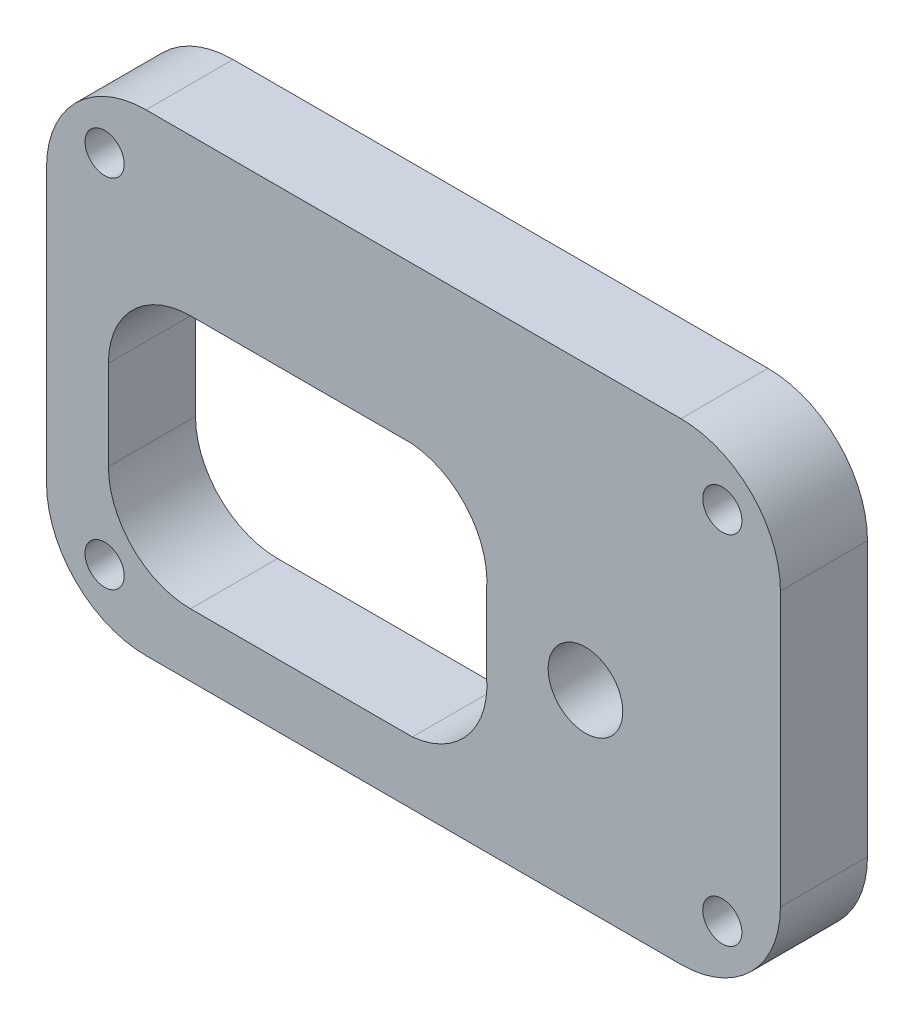
ISO-10303-21;
HEADER;
FILE_DESCRIPTION(('STEP AP214'),'2;1');
FILE_NAME('part.step','',(''),(''),'','','');
FILE_SCHEMA(('AUTOMOTIVE_DESIGN { 1 0 10303 214 1 1 1 1 }'));
ENDSEC;
DATA;
#1=APPLICATION_CONTEXT('core data for automotive mechanical design processes');
#2=APPLICATION_PROTOCOL_DEFINITION('international standard','automotive_design',2000,#1);
#3=PRODUCT_CONTEXT('',#1,'mechanical');
#4=PRODUCT('Part','Part','',(#3));
#5=PRODUCT_RELATED_PRODUCT_CATEGORY('part','',(#4));
#6=PRODUCT_DEFINITION_FORMATION('','',#4);
#7=PRODUCT_DEFINITION_CONTEXT('part definition',#1,'design');
#8=PRODUCT_DEFINITION('design','',#6,#7);
#9=PRODUCT_DEFINITION_SHAPE('','',#8);
#10=(LENGTH_UNIT() NAMED_UNIT(*) SI_UNIT(.MILLI.,.METRE.));
#11=(NAMED_UNIT(*) PLANE_ANGLE_UNIT() SI_UNIT($,.RADIAN.));
#12=(NAMED_UNIT(*) SI_UNIT($,.STERADIAN.) SOLID_ANGLE_UNIT());
#13=UNCERTAINTY_MEASURE_WITH_UNIT(LENGTH_MEASURE(1.E-05),#10,'distance_accuracy_value','');
#14=(GEOMETRIC_REPRESENTATION_CONTEXT(3) GLOBAL_UNCERTAINTY_ASSIGNED_CONTEXT((#13)) GLOBAL_UNIT_ASSIGNED_CONTEXT((#10,
#11,#12)) REPRESENTATION_CONTEXT('',''));
#15=CARTESIAN_POINT('',(0.,0.,0.));
#16=DIRECTION('',(0.,0.,1.));
#17=DIRECTION('',(1.,0.,0.));
#18=AXIS2_PLACEMENT_3D('',#15,#16,#17);
#19=CARTESIAN_POINT('',(0.,0.,4.445));
#20=DIRECTION('',(0.,0.,-1.));
#21=DIRECTION('',(-1.,0.,0.));
#22=AXIS2_PLACEMENT_3D('',#19,#20,#21);
#23=PLANE('',#22);
#24=CARTESIAN_POINT('',(2.96575072425223,2.96575072425223,4.445));
#25=DIRECTION('',(0.,0.,-1.));
#26=DIRECTION('',(-1.,0.,0.));
#27=AXIS2_PLACEMENT_3D('',#24,#25,#26);
#28=CIRCLE('',#27,0.999999999999998);
#29=CARTESIAN_POINT('',(1.96575072425223,2.96575072425223,4.445));
#30=VERTEX_POINT('',#29);
#31=EDGE_CURVE('E458',#30,#30,#28,.T.);
#32=ORIENTED_EDGE('',*,*,#31,.T.);
#33=EDGE_LOOP('',(#32));
#34=FACE_BOUND('',#33,.T.);
#35=CARTESIAN_POINT('',(34.4992492757478,21.1642492757478,4.445));
#36=DIRECTION('',(0.,0.,-1.));
#37=DIRECTION('',(-1.,0.,0.));
#38=AXIS2_PLACEMENT_3D('',#35,#36,#37);
#39=CIRCLE('',#38,0.999999999999998);
#40=CARTESIAN_POINT('',(33.4992492757478,21.1642492757478,4.445));
#41=VERTEX_POINT('',#40);
#42=EDGE_CURVE('E183',#41,#41,#39,.T.);
#43=ORIENTED_EDGE('',*,*,#42,.T.);
#44=EDGE_LOOP('',(#43));
#45=FACE_BOUND('',#44,.T.);
#46=DIRECTION('',(0.,1.,0.));
#47=VECTOR('',#46,1.);
#48=CARTESIAN_POINT('',(37.465,0.,4.445));
#49=LINE('',#48,#47);
#50=CARTESIAN_POINT('',(37.465,5.08,4.445));
#51=VERTEX_POINT('',#50);
#52=CARTESIAN_POINT('',(37.465,19.05,4.445));
#53=VERTEX_POINT('',#52);
#54=EDGE_CURVE('E256',#51,#53,#49,.T.);
#55=ORIENTED_EDGE('',*,*,#54,.T.);
#56=CARTESIAN_POINT('',(32.385,19.05,4.445));
#57=DIRECTION('',(0.,0.,-1.));
#58=DIRECTION('',(-1.,0.,0.));
#59=AXIS2_PLACEMENT_3D('',#56,#57,#58);
#60=CIRCLE('',#59,5.08);
#61=CARTESIAN_POINT('',(32.385,24.13,4.445));
#62=VERTEX_POINT('',#61);
#63=EDGE_CURVE('E312',#53,#62,#60,.F.);
#64=ORIENTED_EDGE('',*,*,#63,.T.);
#65=DIRECTION('',(-1.,0.,0.));
#66=VECTOR('',#65,1.);
#67=CARTESIAN_POINT('',(0.,24.13,4.445));
#68=LINE('',#67,#66);
#69=CARTESIAN_POINT('',(5.08,24.13,4.445));
#70=VERTEX_POINT('',#69);
#71=EDGE_CURVE('E260',#62,#70,#68,.T.);
#72=ORIENTED_EDGE('',*,*,#71,.T.);
#73=CARTESIAN_POINT('',(5.08,19.05,4.445));
#74=DIRECTION('',(0.,0.,-1.));
#75=DIRECTION('',(-1.,0.,0.));
#76=AXIS2_PLACEMENT_3D('',#73,#74,#75);
#77=CIRCLE('',#76,5.08);
#78=CARTESIAN_POINT('',(0.,19.05,4.445));
#79=VERTEX_POINT('',#78);
#80=EDGE_CURVE('E303',#70,#79,#77,.F.);
#81=ORIENTED_EDGE('',*,*,#80,.T.);
#82=DIRECTION('',(0.,-1.,0.));
#83=VECTOR('',#82,1.);
#84=CARTESIAN_POINT('',(0.,0.,4.445));
#85=LINE('',#84,#83);
#86=CARTESIAN_POINT('',(0.,5.08,4.445));
#87=VERTEX_POINT('',#86);
#88=EDGE_CURVE('E248',#79,#87,#85,.T.);
#89=ORIENTED_EDGE('',*,*,#88,.T.);
#90=CARTESIAN_POINT('',(5.08,5.08,4.445));
#91=DIRECTION('',(0.,0.,-1.));
#92=DIRECTION('',(-1.,0.,0.));
#93=AXIS2_PLACEMENT_3D('',#90,#91,#92);
#94=CIRCLE('',#93,5.08);
#95=CARTESIAN_POINT('',(5.08,0.,4.445));
#96=VERTEX_POINT('',#95);
#97=EDGE_CURVE('E306',#87,#96,#94,.F.);
#98=ORIENTED_EDGE('',*,*,#97,.T.);
#99=DIRECTION('',(1.,0.,0.));
#100=VECTOR('',#99,1.);
#101=CARTESIAN_POINT('',(0.,0.,4.445));
#102=LINE('',#101,#100);
#103=CARTESIAN_POINT('',(32.385,0.,4.445));
#104=VERTEX_POINT('',#103);
#105=EDGE_CURVE('E252',#96,#104,#102,.T.);
#106=ORIENTED_EDGE('',*,*,#105,.T.);
#107=CARTESIAN_POINT('',(32.385,5.08,4.445));
#108=DIRECTION('',(0.,0.,-1.));
#109=DIRECTION('',(-1.,0.,0.));
#110=AXIS2_PLACEMENT_3D('',#107,#108,#109);
#111=CIRCLE('',#110,5.08);
#112=EDGE_CURVE('E309',#104,#51,#111,.F.);
#113=ORIENTED_EDGE('',*,*,#112,.T.);
#114=EDGE_LOOP('',(#55,#64,#72,#81,#89,#98,#106,#113));
#115=FACE_BOUND('',#114,.T.);
#116=CARTESIAN_POINT('',(7.35086965438628,11.9679737585275,4.445));
#117=DIRECTION('',(0.,0.,-1.));
#118=DIRECTION('',(-1.,0.,0.));
#119=AXIS2_PLACEMENT_3D('',#116,#117,#118);
#120=CIRCLE('',#119,4.19100000000001);
#121=CARTESIAN_POINT('',(7.35086965438628,16.1589737585275,4.445));
#122=VERTEX_POINT('',#121);
#123=CARTESIAN_POINT('',(3.15986965438627,11.9679737585275,4.445));
#124=VERTEX_POINT('',#123);
#125=EDGE_CURVE('E205',#122,#124,#120,.F.);
#126=ORIENTED_EDGE('',*,*,#125,.F.);
#127=DIRECTION('',(-1.,0.,0.));
#128=VECTOR('',#127,1.);
#129=CARTESIAN_POINT('',(0.,16.1589737585275,4.445));
#130=LINE('',#129,#128);
#131=CARTESIAN_POINT('',(18.6779953133422,16.1589737585275,4.445));
#132=VERTEX_POINT('',#131);
#133=EDGE_CURVE('E201',#132,#122,#130,.T.);
#134=ORIENTED_EDGE('',*,*,#133,.F.);
#135=CARTESIAN_POINT('',(18.2728696543863,11.9679737585275,4.445));
#136=DIRECTION('',(0.,0.,-1.));
#137=DIRECTION('',(-1.,0.,0.));
#138=AXIS2_PLACEMENT_3D('',#135,#136,#137);
#139=CIRCLE('',#138,4.21053533408098);
#140=CARTESIAN_POINT('',(22.4638696543863,11.5628480995716,4.445));
#141=VERTEX_POINT('',#140);
#142=EDGE_CURVE('E197',#141,#132,#139,.F.);
#143=ORIENTED_EDGE('',*,*,#142,.F.);
#144=DIRECTION('',(0.,1.,0.));
#145=VECTOR('',#144,1.);
#146=CARTESIAN_POINT('',(22.4638696543863,0.,4.445));
#147=LINE('',#146,#145);
#148=CARTESIAN_POINT('',(22.4638696543863,7.80109941748326,4.445));
#149=VERTEX_POINT('',#148);
#150=EDGE_CURVE('E193',#149,#141,#147,.T.);
#151=ORIENTED_EDGE('',*,*,#150,.F.);
#152=CARTESIAN_POINT('',(18.2728696543863,7.39597375852747,4.445));
#153=DIRECTION('',(0.,0.,-1.));
#154=DIRECTION('',(-1.,0.,0.));
#155=AXIS2_PLACEMENT_3D('',#152,#153,#154);
#156=CIRCLE('',#155,4.21053533408095);
#157=CARTESIAN_POINT('',(18.6779953133419,3.20497375852747,4.445));
#158=VERTEX_POINT('',#157);
#159=EDGE_CURVE('E178',#158,#149,#156,.F.);
#160=ORIENTED_EDGE('',*,*,#159,.F.);
#161=DIRECTION('',(1.,0.,0.));
#162=VECTOR('',#161,1.);
#163=CARTESIAN_POINT('',(0.,3.20497375852747,4.445));
#164=LINE('',#163,#162);
#165=CARTESIAN_POINT('',(7.35086965438665,3.20497375852747,4.445));
#166=VERTEX_POINT('',#165);
#167=EDGE_CURVE('E160',#166,#158,#164,.T.);
#168=ORIENTED_EDGE('',*,*,#167,.F.);
#169=CARTESIAN_POINT('',(7.35086965438626,7.39597375852747,4.445));
#170=DIRECTION('',(0.,0.,-1.));
#171=DIRECTION('',(-1.,0.,0.));
#172=AXIS2_PLACEMENT_3D('',#169,#170,#171);
#173=CIRCLE('',#172,4.191);
#174=CARTESIAN_POINT('',(3.15986965438626,7.39597375852747,4.445));
#175=VERTEX_POINT('',#174);
#176=EDGE_CURVE('E175',#175,#166,#173,.F.);
#177=ORIENTED_EDGE('',*,*,#176,.F.);
#178=DIRECTION('',(0.,-1.,0.));
#179=VECTOR('',#178,1.);
#180=CARTESIAN_POINT('',(3.15986965438626,0.,4.445));
#181=LINE('',#180,#179);
#182=EDGE_CURVE('E209',#124,#175,#181,.T.);
#183=ORIENTED_EDGE('',*,*,#182,.F.);
#184=EDGE_LOOP('',(#126,#134,#143,#151,#160,#168,#177,#183));
#185=FACE_BOUND('',#184,.T.);
#186=CARTESIAN_POINT('',(27.511650568665,9.68988988046832,4.445));
#187=DIRECTION('',(0.,0.,-1.));
#188=DIRECTION('',(-1.,0.,0.));
#189=AXIS2_PLACEMENT_3D('',#186,#187,#188);
#190=CIRCLE('',#189,1.905);
#191=CARTESIAN_POINT('',(25.606650568665,9.68988988046832,4.445));
#192=VERTEX_POINT('',#191);
#193=EDGE_CURVE('E212',#192,#192,#190,.F.);
#194=ORIENTED_EDGE('',*,*,#193,.F.);
#195=EDGE_LOOP('',(#194));
#196=FACE_BOUND('',#195,.T.);
#197=CARTESIAN_POINT('',(2.96575072425223,21.1642492757478,4.445));
#198=DIRECTION('',(0.,0.,-1.));
#199=DIRECTION('',(-1.,0.,0.));
#200=AXIS2_PLACEMENT_3D('',#197,#198,#199);
#201=CIRCLE('',#200,0.999999999999998);
#202=CARTESIAN_POINT('',(1.96575072425223,21.1642492757478,4.445));
#203=VERTEX_POINT('',#202);
#204=EDGE_CURVE('E465',#203,#203,#201,.F.);
#205=ORIENTED_EDGE('',*,*,#204,.F.);
#206=EDGE_LOOP('',(#205));
#207=FACE_BOUND('',#206,.T.);
#208=CARTESIAN_POINT('',(34.4992492757478,2.96575072425222,4.445));
#209=DIRECTION('',(0.,0.,-1.));
#210=DIRECTION('',(-1.,0.,0.));
#211=AXIS2_PLACEMENT_3D('',#208,#209,#210);
#212=CIRCLE('',#211,0.999999999999998);
#213=CARTESIAN_POINT('',(33.4992492757478,2.96575072425222,4.445));
#214=VERTEX_POINT('',#213);
#215=EDGE_CURVE('E450',#214,#214,#212,.F.);
#216=ORIENTED_EDGE('',*,*,#215,.F.);
#217=EDGE_LOOP('',(#216));
#218=FACE_BOUND('',#217,.T.);
#219=ADVANCED_FACE('F41',(#34,#45,#115,#185,#196,#207,#218),#23,.F.);
#220=CARTESIAN_POINT('',(0.,0.,0.));
#221=DIRECTION('',(0.,0.,-1.));
#222=DIRECTION('',(-1.,0.,0.));
#223=AXIS2_PLACEMENT_3D('',#220,#221,#222);
#224=PLANE('',#223);
#225=CARTESIAN_POINT('',(2.96575072425223,21.1642492757478,0.));
#226=DIRECTION('',(0.,0.,-1.));
#227=DIRECTION('',(-1.,0.,0.));
#228=AXIS2_PLACEMENT_3D('',#225,#226,#227);
#229=CIRCLE('',#228,0.999999999999998);
#230=CARTESIAN_POINT('',(1.96575072425223,21.1642492757478,0.));
#231=VERTEX_POINT('',#230);
#232=EDGE_CURVE('E461',#231,#231,#229,.F.);
#233=ORIENTED_EDGE('',*,*,#232,.T.);
#234=EDGE_LOOP('',(#233));
#235=FACE_BOUND('',#234,.T.);
#236=CARTESIAN_POINT('',(34.4992492757478,21.1642492757478,0.));
#237=DIRECTION('',(0.,0.,-1.));
#238=DIRECTION('',(-1.,0.,0.));
#239=AXIS2_PLACEMENT_3D('',#236,#237,#238);
#240=CIRCLE('',#239,0.999999999999998);
#241=CARTESIAN_POINT('',(33.4992492757478,21.1642492757478,0.));
#242=VERTEX_POINT('',#241);
#243=EDGE_CURVE('E187',#242,#242,#240,.T.);
#244=ORIENTED_EDGE('',*,*,#243,.F.);
#245=EDGE_LOOP('',(#244));
#246=FACE_BOUND('',#245,.T.);
#247=CARTESIAN_POINT('',(27.511650568665,9.68988988046832,0.));
#248=DIRECTION('',(0.,0.,-1.));
#249=DIRECTION('',(-1.,0.,0.));
#250=AXIS2_PLACEMENT_3D('',#247,#248,#249);
#251=CIRCLE('',#250,1.27);
#252=CARTESIAN_POINT('',(26.241650568665,9.68988988046832,0.));
#253=VERTEX_POINT('',#252);
#254=EDGE_CURVE('E224',#253,#253,#251,.T.);
#255=ORIENTED_EDGE('',*,*,#254,.F.);
#256=EDGE_LOOP('',(#255));
#257=FACE_BOUND('',#256,.T.);
#258=CARTESIAN_POINT('',(7.35086965438628,11.9679737585275,0.));
#259=DIRECTION('',(0.,0.,-1.));
#260=DIRECTION('',(-1.,0.,0.));
#261=AXIS2_PLACEMENT_3D('',#258,#259,#260);
#262=CIRCLE('',#261,4.19100000000001);
#263=CARTESIAN_POINT('',(3.15986965438626,11.9679737585274,0.));
#264=VERTEX_POINT('',#263);
#265=CARTESIAN_POINT('',(7.35086965438628,16.1589737585275,0.));
#266=VERTEX_POINT('',#265);
#267=EDGE_CURVE('E11',#264,#266,#262,.T.);
#268=ORIENTED_EDGE('',*,*,#267,.F.);
#269=DIRECTION('',(0.,1.,0.));
#270=VECTOR('',#269,1.);
#271=CARTESIAN_POINT('',(3.15986965438626,0.,0.));
#272=LINE('',#271,#270);
#273=CARTESIAN_POINT('',(3.15986965438626,7.39597375852747,0.));
#274=VERTEX_POINT('',#273);
#275=EDGE_CURVE('E328',#274,#264,#272,.T.);
#276=ORIENTED_EDGE('',*,*,#275,.F.);
#277=CARTESIAN_POINT('',(7.35086965438626,7.39597375852747,0.));
#278=DIRECTION('',(0.,0.,-1.));
#279=DIRECTION('',(-1.,0.,0.));
#280=AXIS2_PLACEMENT_3D('',#277,#278,#279);
#281=CIRCLE('',#280,4.191);
#282=CARTESIAN_POINT('',(7.35086965438665,3.20497375852747,0.));
#283=VERTEX_POINT('',#282);
#284=EDGE_CURVE('E331',#283,#274,#281,.T.);
#285=ORIENTED_EDGE('',*,*,#284,.F.);
#286=DIRECTION('',(-1.,0.,0.));
#287=VECTOR('',#286,1.);
#288=CARTESIAN_POINT('',(0.,3.20497375852747,0.));
#289=LINE('',#288,#287);
#290=CARTESIAN_POINT('',(18.6779953133419,3.20497375852747,0.));
#291=VERTEX_POINT('',#290);
#292=EDGE_CURVE('E162',#291,#283,#289,.T.);
#293=ORIENTED_EDGE('',*,*,#292,.F.);
#294=CARTESIAN_POINT('',(18.2728696543863,7.39597375852747,0.));
#295=DIRECTION('',(0.,0.,-1.));
#296=DIRECTION('',(-1.,0.,0.));
#297=AXIS2_PLACEMENT_3D('',#294,#295,#296);
#298=CIRCLE('',#297,4.21053533408095);
#299=CARTESIAN_POINT('',(22.4638696543863,7.80109941748326,0.));
#300=VERTEX_POINT('',#299);
#301=EDGE_CURVE('E336',#300,#291,#298,.T.);
#302=ORIENTED_EDGE('',*,*,#301,.F.);
#303=DIRECTION('',(0.,1.,0.));
#304=VECTOR('',#303,1.);
#305=CARTESIAN_POINT('',(22.4638696543863,0.,0.));
#306=LINE('',#305,#304);
#307=CARTESIAN_POINT('',(22.4638696543863,11.5628480995716,0.));
#308=VERTEX_POINT('',#307);
#309=EDGE_CURVE('E339',#300,#308,#306,.T.);
#310=ORIENTED_EDGE('',*,*,#309,.T.);
#311=CARTESIAN_POINT('',(18.2728696543863,11.9679737585275,0.));
#312=DIRECTION('',(0.,0.,-1.));
#313=DIRECTION('',(-1.,0.,0.));
#314=AXIS2_PLACEMENT_3D('',#311,#312,#313);
#315=CIRCLE('',#314,4.21053533408098);
#316=CARTESIAN_POINT('',(18.6779953133422,16.1589737585275,0.));
#317=VERTEX_POINT('',#316);
#318=EDGE_CURVE('E343',#308,#317,#315,.F.);
#319=ORIENTED_EDGE('',*,*,#318,.T.);
#320=DIRECTION('',(-1.,0.,0.));
#321=VECTOR('',#320,1.);
#322=CARTESIAN_POINT('',(0.,16.1589737585275,0.));
#323=LINE('',#322,#321);
#324=EDGE_CURVE('E50',#317,#266,#323,.T.);
#325=ORIENTED_EDGE('',*,*,#324,.T.);
#326=EDGE_LOOP('',(#268,#276,#285,#293,#302,#310,#319,#325));
#327=FACE_BOUND('',#326,.T.);
#328=DIRECTION('',(-1.,0.,0.));
#329=VECTOR('',#328,1.);
#330=CARTESIAN_POINT('',(0.,24.13,0.));
#331=LINE('',#330,#329);
#332=CARTESIAN_POINT('',(32.385,24.13,0.));
#333=VERTEX_POINT('',#332);
#334=CARTESIAN_POINT('',(5.08,24.13,0.));
#335=VERTEX_POINT('',#334);
#336=EDGE_CURVE('E253',#333,#335,#331,.T.);
#337=ORIENTED_EDGE('',*,*,#336,.F.);
#338=CARTESIAN_POINT('',(32.385,19.05,0.));
#339=DIRECTION('',(0.,0.,-1.));
#340=DIRECTION('',(-1.,0.,0.));
#341=AXIS2_PLACEMENT_3D('',#338,#339,#340);
#342=CIRCLE('',#341,5.08);
#343=CARTESIAN_POINT('',(37.465,19.05,0.));
#344=VERTEX_POINT('',#343);
#345=EDGE_CURVE('E293',#333,#344,#342,.T.);
#346=ORIENTED_EDGE('',*,*,#345,.T.);
#347=DIRECTION('',(0.,1.,0.));
#348=VECTOR('',#347,1.);
#349=CARTESIAN_POINT('',(37.465,0.,0.));
#350=LINE('',#349,#348);
#351=CARTESIAN_POINT('',(37.465,5.08,0.));
#352=VERTEX_POINT('',#351);
#353=EDGE_CURVE('E271',#352,#344,#350,.T.);
#354=ORIENTED_EDGE('',*,*,#353,.F.);
#355=CARTESIAN_POINT('',(32.385,5.08,0.));
#356=DIRECTION('',(0.,0.,-1.));
#357=DIRECTION('',(-1.,0.,0.));
#358=AXIS2_PLACEMENT_3D('',#355,#356,#357);
#359=CIRCLE('',#358,5.08);
#360=CARTESIAN_POINT('',(32.385,0.,0.));
#361=VERTEX_POINT('',#360);
#362=EDGE_CURVE('E290',#352,#361,#359,.T.);
#363=ORIENTED_EDGE('',*,*,#362,.T.);
#364=DIRECTION('',(1.,0.,0.));
#365=VECTOR('',#364,1.);
#366=CARTESIAN_POINT('',(0.,0.,0.));
#367=LINE('',#366,#365);
#368=CARTESIAN_POINT('',(5.08,0.,0.));
#369=VERTEX_POINT('',#368);
#370=EDGE_CURVE('E268',#369,#361,#367,.T.);
#371=ORIENTED_EDGE('',*,*,#370,.F.);
#372=CARTESIAN_POINT('',(5.08,5.08,0.));
#373=DIRECTION('',(0.,0.,-1.));
#374=DIRECTION('',(-1.,0.,0.));
#375=AXIS2_PLACEMENT_3D('',#372,#373,#374);
#376=CIRCLE('',#375,5.08);
#377=CARTESIAN_POINT('',(0.,5.08,0.));
#378=VERTEX_POINT('',#377);
#379=EDGE_CURVE('E287',#369,#378,#376,.T.);
#380=ORIENTED_EDGE('',*,*,#379,.T.);
#381=DIRECTION('',(0.,-1.,0.));
#382=VECTOR('',#381,1.);
#383=CARTESIAN_POINT('',(0.,0.,0.));
#384=LINE('',#383,#382);
#385=CARTESIAN_POINT('',(0.,19.05,0.));
#386=VERTEX_POINT('',#385);
#387=EDGE_CURVE('E232',#386,#378,#384,.T.);
#388=ORIENTED_EDGE('',*,*,#387,.F.);
#389=CARTESIAN_POINT('',(5.08,19.05,0.));
#390=DIRECTION('',(0.,0.,-1.));
#391=DIRECTION('',(-1.,0.,0.));
#392=AXIS2_PLACEMENT_3D('',#389,#390,#391);
#393=CIRCLE('',#392,5.08);
#394=EDGE_CURVE('E284',#386,#335,#393,.T.);
#395=ORIENTED_EDGE('',*,*,#394,.T.);
#396=EDGE_LOOP('',(#337,#346,#354,#363,#371,#380,#388,#395));
#397=FACE_BOUND('',#396,.T.);
#398=CARTESIAN_POINT('',(2.96575072425223,2.96575072425223,0.));
#399=DIRECTION('',(0.,0.,-1.));
#400=DIRECTION('',(-1.,0.,0.));
#401=AXIS2_PLACEMENT_3D('',#398,#399,#400);
#402=CIRCLE('',#401,0.999999999999998);
#403=CARTESIAN_POINT('',(1.96575072425223,2.96575072425223,0.));
#404=VERTEX_POINT('',#403);
#405=EDGE_CURVE('E444',#404,#404,#402,.T.);
#406=ORIENTED_EDGE('',*,*,#405,.F.);
#407=EDGE_LOOP('',(#406));
#408=FACE_BOUND('',#407,.T.);
#409=CARTESIAN_POINT('',(34.4992492757478,2.96575072425222,0.));
#410=DIRECTION('',(0.,0.,-1.));
#411=DIRECTION('',(-1.,0.,0.));
#412=AXIS2_PLACEMENT_3D('',#409,#410,#411);
#413=CIRCLE('',#412,0.999999999999998);
#414=CARTESIAN_POINT('',(33.4992492757478,2.96575072425222,0.));
#415=VERTEX_POINT('',#414);
#416=EDGE_CURVE('E447',#415,#415,#413,.F.);
#417=ORIENTED_EDGE('',*,*,#416,.T.);
#418=EDGE_LOOP('',(#417));
#419=FACE_BOUND('',#418,.T.);
#420=ADVANCED_FACE('F350',(#235,#246,#257,#327,#397,#408,#419),#224,.T.);
#421=CARTESIAN_POINT('',(27.511650568665,9.68988988046832,-0.635000000000001));
#422=DIRECTION('',(0.,0.,1.));
#423=DIRECTION('',(1.,0.,0.));
#424=AXIS2_PLACEMENT_3D('',#421,#422,#423);
#425=CYLINDRICAL_SURFACE('',#424,1.27);
#426=ORIENTED_EDGE('',*,*,#254,.T.);
#427=EDGE_LOOP('',(#426));
#428=FACE_BOUND('',#427,.T.);
#429=CARTESIAN_POINT('',(27.511650568665,9.68988988046832,1.27));
#430=DIRECTION('',(0.,0.,1.));
#431=DIRECTION('',(1.,0.,0.));
#432=AXIS2_PLACEMENT_3D('',#429,#430,#431);
#433=CIRCLE('',#432,1.27);
#434=CARTESIAN_POINT('',(28.781650568665,9.68988988046832,1.27));
#435=VERTEX_POINT('',#434);
#436=EDGE_CURVE('E216',#435,#435,#433,.T.);
#437=ORIENTED_EDGE('',*,*,#436,.T.);
#438=EDGE_LOOP('',(#437));
#439=FACE_BOUND('',#438,.T.);
#440=ADVANCED_FACE('F389',(#428,#439),#425,.F.);
#441=CARTESIAN_POINT('',(0.,0.,4.445));
#442=DIRECTION('',(1.,0.,0.));
#443=DIRECTION('',(0.,0.,-1.));
#444=AXIS2_PLACEMENT_3D('',#441,#442,#443);
#445=PLANE('',#444);
#446=ORIENTED_EDGE('',*,*,#387,.T.);
#447=DIRECTION('',(0.,0.,-1.));
#448=VECTOR('',#447,1.);
#449=CARTESIAN_POINT('',(0.,5.08,4.445));
#450=LINE('',#449,#448);
#451=EDGE_CURVE('E325',#378,#87,#450,.F.);
#452=ORIENTED_EDGE('',*,*,#451,.T.);
#453=ORIENTED_EDGE('',*,*,#88,.F.);
#454=DIRECTION('',(0.,0.,-1.));
#455=VECTOR('',#454,1.);
#456=CARTESIAN_POINT('',(0.,19.05,4.445));
#457=LINE('',#456,#455);
#458=EDGE_CURVE('E321',#79,#386,#457,.T.);
#459=ORIENTED_EDGE('',*,*,#458,.T.);
#460=EDGE_LOOP('',(#446,#452,#453,#459));
#461=FACE_BOUND('',#460,.T.);
#462=ADVANCED_FACE('F407',(#461),#445,.F.);
#463=CARTESIAN_POINT('',(0.,0.,4.445));
#464=DIRECTION('',(0.,1.,0.));
#465=DIRECTION('',(0.,0.,1.));
#466=AXIS2_PLACEMENT_3D('',#463,#464,#465);
#467=PLANE('',#466);
#468=ORIENTED_EDGE('',*,*,#370,.T.);
#469=DIRECTION('',(0.,0.,-1.));
#470=VECTOR('',#469,1.);
#471=CARTESIAN_POINT('',(32.385,0.,4.445));
#472=LINE('',#471,#470);
#473=EDGE_CURVE('E65',#361,#104,#472,.F.);
#474=ORIENTED_EDGE('',*,*,#473,.T.);
#475=ORIENTED_EDGE('',*,*,#105,.F.);
#476=DIRECTION('',(0.,0.,-1.));
#477=VECTOR('',#476,1.);
#478=CARTESIAN_POINT('',(5.08,0.,4.445));
#479=LINE('',#478,#477);
#480=EDGE_CURVE('E315',#96,#369,#479,.T.);
#481=ORIENTED_EDGE('',*,*,#480,.T.);
#482=EDGE_LOOP('',(#468,#474,#475,#481));
#483=FACE_BOUND('',#482,.T.);
#484=ADVANCED_FACE('F403',(#483),#467,.F.);
#485=CARTESIAN_POINT('',(37.465,0.,4.445));
#486=DIRECTION('',(-1.,0.,0.));
#487=DIRECTION('',(0.,0.,1.));
#488=AXIS2_PLACEMENT_3D('',#485,#486,#487);
#489=PLANE('',#488);
#490=ORIENTED_EDGE('',*,*,#353,.T.);
#491=DIRECTION('',(0.,0.,-1.));
#492=VECTOR('',#491,1.);
#493=CARTESIAN_POINT('',(37.465,19.05,4.445));
#494=LINE('',#493,#492);
#495=EDGE_CURVE('E300',#344,#53,#494,.F.);
#496=ORIENTED_EDGE('',*,*,#495,.T.);
#497=ORIENTED_EDGE('',*,*,#54,.F.);
#498=DIRECTION('',(0.,0.,-1.));
#499=VECTOR('',#498,1.);
#500=CARTESIAN_POINT('',(37.465,5.08,4.445));
#501=LINE('',#500,#499);
#502=EDGE_CURVE('E296',#51,#352,#501,.T.);
#503=ORIENTED_EDGE('',*,*,#502,.T.);
#504=EDGE_LOOP('',(#490,#496,#497,#503));
#505=FACE_BOUND('',#504,.T.);
#506=ADVANCED_FACE('F399',(#505),#489,.F.);
#507=CARTESIAN_POINT('',(0.,24.13,4.445));
#508=DIRECTION('',(0.,-1.,0.));
#509=DIRECTION('',(0.,0.,-1.));
#510=AXIS2_PLACEMENT_3D('',#507,#508,#509);
#511=PLANE('',#510);
#512=ORIENTED_EDGE('',*,*,#71,.F.);
#513=DIRECTION('',(0.,0.,-1.));
#514=VECTOR('',#513,1.);
#515=CARTESIAN_POINT('',(32.385,24.13,4.445));
#516=LINE('',#515,#514);
#517=EDGE_CURVE('E280',#62,#333,#516,.T.);
#518=ORIENTED_EDGE('',*,*,#517,.T.);
#519=ORIENTED_EDGE('',*,*,#336,.T.);
#520=DIRECTION('',(0.,0.,-1.));
#521=VECTOR('',#520,1.);
#522=CARTESIAN_POINT('',(5.08,24.13,4.445));
#523=LINE('',#522,#521);
#524=EDGE_CURVE('E264',#335,#70,#523,.F.);
#525=ORIENTED_EDGE('',*,*,#524,.T.);
#526=EDGE_LOOP('',(#512,#518,#519,#525));
#527=FACE_BOUND('',#526,.T.);
#528=ADVANCED_FACE('F395',(#527),#511,.F.);
#529=CARTESIAN_POINT('',(32.385,19.05,4.445));
#530=DIRECTION('',(0.,0.,-1.));
#531=DIRECTION('',(-1.,0.,0.));
#532=AXIS2_PLACEMENT_3D('',#529,#530,#531);
#533=CYLINDRICAL_SURFACE('',#532,5.08);
#534=ORIENTED_EDGE('',*,*,#63,.F.);
#535=ORIENTED_EDGE('',*,*,#495,.F.);
#536=ORIENTED_EDGE('',*,*,#345,.F.);
#537=ORIENTED_EDGE('',*,*,#517,.F.);
#538=EDGE_LOOP('',(#534,#535,#536,#537));
#539=FACE_BOUND('',#538,.T.);
#540=ADVANCED_FACE('F398',(#539),#533,.T.);
#541=CARTESIAN_POINT('',(32.385,5.08,4.445));
#542=DIRECTION('',(0.,0.,-1.));
#543=DIRECTION('',(-1.,0.,0.));
#544=AXIS2_PLACEMENT_3D('',#541,#542,#543);
#545=CYLINDRICAL_SURFACE('',#544,5.08);
#546=ORIENTED_EDGE('',*,*,#112,.F.);
#547=ORIENTED_EDGE('',*,*,#473,.F.);
#548=ORIENTED_EDGE('',*,*,#362,.F.);
#549=ORIENTED_EDGE('',*,*,#502,.F.);
#550=EDGE_LOOP('',(#546,#547,#548,#549));
#551=FACE_BOUND('',#550,.T.);
#552=ADVANCED_FACE('F413',(#551),#545,.T.);
#553=CARTESIAN_POINT('',(5.08,5.08,4.445));
#554=DIRECTION('',(0.,0.,-1.));
#555=DIRECTION('',(-1.,0.,0.));
#556=AXIS2_PLACEMENT_3D('',#553,#554,#555);
#557=CYLINDRICAL_SURFACE('',#556,5.08);
#558=ORIENTED_EDGE('',*,*,#97,.F.);
#559=ORIENTED_EDGE('',*,*,#451,.F.);
#560=ORIENTED_EDGE('',*,*,#379,.F.);
#561=ORIENTED_EDGE('',*,*,#480,.F.);
#562=EDGE_LOOP('',(#558,#559,#560,#561));
#563=FACE_BOUND('',#562,.T.);
#564=ADVANCED_FACE('F380',(#563),#557,.T.);
#565=CARTESIAN_POINT('',(5.08,19.05,4.445));
#566=DIRECTION('',(0.,0.,-1.));
#567=DIRECTION('',(-1.,0.,0.));
#568=AXIS2_PLACEMENT_3D('',#565,#566,#567);
#569=CYLINDRICAL_SURFACE('',#568,5.08);
#570=ORIENTED_EDGE('',*,*,#80,.F.);
#571=ORIENTED_EDGE('',*,*,#524,.F.);
#572=ORIENTED_EDGE('',*,*,#394,.F.);
#573=ORIENTED_EDGE('',*,*,#458,.F.);
#574=EDGE_LOOP('',(#570,#571,#572,#573));
#575=FACE_BOUND('',#574,.T.);
#576=ADVANCED_FACE('F43',(#575),#569,.T.);
#577=CARTESIAN_POINT('',(7.35086965438628,11.9679737585275,-0.635000000000001));
#578=DIRECTION('',(0.,0.,1.));
#579=DIRECTION('',(1.,0.,0.));
#580=AXIS2_PLACEMENT_3D('',#577,#578,#579);
#581=CYLINDRICAL_SURFACE('',#580,4.19100000000001);
#582=ORIENTED_EDGE('',*,*,#267,.T.);
#583=DIRECTION('',(0.,0.,1.));
#584=VECTOR('',#583,1.);
#585=CARTESIAN_POINT('',(7.35086965438628,16.1589737585275,-0.635000000000001));
#586=LINE('',#585,#584);
#587=EDGE_CURVE('E229',#266,#122,#586,.T.);
#588=ORIENTED_EDGE('',*,*,#587,.T.);
#589=ORIENTED_EDGE('',*,*,#125,.T.);
#590=DIRECTION('',(0.,0.,1.));
#591=VECTOR('',#590,1.);
#592=CARTESIAN_POINT('',(3.15986965438626,11.9679737585274,-0.635000000000001));
#593=LINE('',#592,#591);
#594=EDGE_CURVE('E228',#264,#124,#593,.T.);
#595=ORIENTED_EDGE('',*,*,#594,.F.);
#596=EDGE_LOOP('',(#582,#588,#589,#595));
#597=FACE_BOUND('',#596,.T.);
#598=ADVANCED_FACE('F371',(#597),#581,.F.);
#599=CARTESIAN_POINT('',(7.35086965438628,16.1589737585275,-0.635000000000001));
#600=DIRECTION('',(0.,-1.,0.));
#601=DIRECTION('',(0.,0.,-1.));
#602=AXIS2_PLACEMENT_3D('',#599,#600,#601);
#603=PLANE('',#602);
#604=DIRECTION('',(0.,0.,1.));
#605=VECTOR('',#604,1.);
#606=CARTESIAN_POINT('',(18.6779953133422,16.1589737585275,-0.635000000000001));
#607=LINE('',#606,#605);
#608=EDGE_CURVE('E233',#317,#132,#607,.T.);
#609=ORIENTED_EDGE('',*,*,#608,.T.);
#610=ORIENTED_EDGE('',*,*,#133,.T.);
#611=ORIENTED_EDGE('',*,*,#587,.F.);
#612=ORIENTED_EDGE('',*,*,#324,.F.);
#613=EDGE_LOOP('',(#609,#610,#611,#612));
#614=FACE_BOUND('',#613,.T.);
#615=ADVANCED_FACE('F356',(#614),#603,.T.);
#616=CARTESIAN_POINT('',(18.2728696543863,11.9679737585275,-0.635000000000001));
#617=DIRECTION('',(0.,0.,1.));
#618=DIRECTION('',(1.,0.,0.));
#619=AXIS2_PLACEMENT_3D('',#616,#617,#618);
#620=CYLINDRICAL_SURFACE('',#619,4.21053533408098);
#621=DIRECTION('',(0.,0.,1.));
#622=VECTOR('',#621,1.);
#623=CARTESIAN_POINT('',(22.4638696543863,11.5628480995716,-0.635000000000001));
#624=LINE('',#623,#622);
#625=EDGE_CURVE('E236',#308,#141,#624,.T.);
#626=ORIENTED_EDGE('',*,*,#625,.T.);
#627=ORIENTED_EDGE('',*,*,#142,.T.);
#628=ORIENTED_EDGE('',*,*,#608,.F.);
#629=ORIENTED_EDGE('',*,*,#318,.F.);
#630=EDGE_LOOP('',(#626,#627,#628,#629));
#631=FACE_BOUND('',#630,.T.);
#632=ADVANCED_FACE('F359',(#631),#620,.F.);
#633=CARTESIAN_POINT('',(22.4638696543863,11.5628480995716,-0.635000000000001));
#634=DIRECTION('',(-1.,0.,0.));
#635=DIRECTION('',(0.,0.,1.));
#636=AXIS2_PLACEMENT_3D('',#633,#634,#635);
#637=PLANE('',#636);
#638=DIRECTION('',(0.,0.,1.));
#639=VECTOR('',#638,1.);
#640=CARTESIAN_POINT('',(22.4638696543863,7.80109941748326,-0.635000000000001));
#641=LINE('',#640,#639);
#642=EDGE_CURVE('E239',#300,#149,#641,.T.);
#643=ORIENTED_EDGE('',*,*,#642,.T.);
#644=ORIENTED_EDGE('',*,*,#150,.T.);
#645=ORIENTED_EDGE('',*,*,#625,.F.);
#646=ORIENTED_EDGE('',*,*,#309,.F.);
#647=EDGE_LOOP('',(#643,#644,#645,#646));
#648=FACE_BOUND('',#647,.T.);
#649=ADVANCED_FACE('F363',(#648),#637,.T.);
#650=CARTESIAN_POINT('',(18.2728696543863,7.39597375852747,-0.635000000000001));
#651=DIRECTION('',(0.,0.,1.));
#652=DIRECTION('',(1.,0.,0.));
#653=AXIS2_PLACEMENT_3D('',#650,#651,#652);
#654=CYLINDRICAL_SURFACE('',#653,4.21053533408095);
#655=ORIENTED_EDGE('',*,*,#301,.T.);
#656=DIRECTION('',(0.,0.,1.));
#657=VECTOR('',#656,1.);
#658=CARTESIAN_POINT('',(18.6779953133419,3.20497375852747,-0.635000000000001));
#659=LINE('',#658,#657);
#660=EDGE_CURVE('E167',#291,#158,#659,.T.);
#661=ORIENTED_EDGE('',*,*,#660,.T.);
#662=ORIENTED_EDGE('',*,*,#159,.T.);
#663=ORIENTED_EDGE('',*,*,#642,.F.);
#664=EDGE_LOOP('',(#655,#661,#662,#663));
#665=FACE_BOUND('',#664,.T.);
#666=ADVANCED_FACE('F367',(#665),#654,.F.);
#667=CARTESIAN_POINT('',(7.35086965438665,3.20497375852747,-0.635000000000001));
#668=DIRECTION('',(0.,-1.,0.));
#669=DIRECTION('',(1.,0.,0.));
#670=AXIS2_PLACEMENT_3D('',#667,#668,#669);
#671=PLANE('',#670);
#672=ORIENTED_EDGE('',*,*,#292,.T.);
#673=DIRECTION('',(0.,0.,1.));
#674=VECTOR('',#673,1.);
#675=CARTESIAN_POINT('',(7.35086965438665,3.20497375852747,-0.635000000000001));
#676=LINE('',#675,#674);
#677=EDGE_CURVE('E156',#283,#166,#676,.T.);
#678=ORIENTED_EDGE('',*,*,#677,.T.);
#679=ORIENTED_EDGE('',*,*,#167,.T.);
#680=ORIENTED_EDGE('',*,*,#660,.F.);
#681=EDGE_LOOP('',(#672,#678,#679,#680));
#682=FACE_BOUND('',#681,.T.);
#683=ADVANCED_FACE('F158',(#682),#671,.F.);
#684=CARTESIAN_POINT('',(7.35086965438626,7.39597375852747,-0.635000000000001));
#685=DIRECTION('',(0.,0.,1.));
#686=DIRECTION('',(1.,0.,0.));
#687=AXIS2_PLACEMENT_3D('',#684,#685,#686);
#688=CYLINDRICAL_SURFACE('',#687,4.191);
#689=ORIENTED_EDGE('',*,*,#284,.T.);
#690=DIRECTION('',(0.,0.,1.));
#691=VECTOR('',#690,1.);
#692=CARTESIAN_POINT('',(3.15986965438626,7.39597375852747,-0.635000000000001));
#693=LINE('',#692,#691);
#694=EDGE_CURVE('E57',#274,#175,#693,.T.);
#695=ORIENTED_EDGE('',*,*,#694,.T.);
#696=ORIENTED_EDGE('',*,*,#176,.T.);
#697=ORIENTED_EDGE('',*,*,#677,.F.);
#698=EDGE_LOOP('',(#689,#695,#696,#697));
#699=FACE_BOUND('',#698,.T.);
#700=ADVANCED_FACE('F181',(#699),#688,.F.);
#701=CARTESIAN_POINT('',(3.15986965438626,11.9679737585274,-0.635000000000001));
#702=DIRECTION('',(-1.,0.,0.));
#703=DIRECTION('',(0.,-1.,0.));
#704=AXIS2_PLACEMENT_3D('',#701,#702,#703);
#705=PLANE('',#704);
#706=ORIENTED_EDGE('',*,*,#275,.T.);
#707=ORIENTED_EDGE('',*,*,#594,.T.);
#708=ORIENTED_EDGE('',*,*,#182,.T.);
#709=ORIENTED_EDGE('',*,*,#694,.F.);
#710=EDGE_LOOP('',(#706,#707,#708,#709));
#711=FACE_BOUND('',#710,.T.);
#712=ADVANCED_FACE('F369',(#711),#705,.F.);
#713=CARTESIAN_POINT('',(27.511650568665,9.68988988046832,1.27));
#714=DIRECTION('',(0.,0.,1.));
#715=DIRECTION('',(1.,0.,0.));
#716=AXIS2_PLACEMENT_3D('',#713,#714,#715);
#717=CYLINDRICAL_SURFACE('',#716,1.905);
#718=CARTESIAN_POINT('',(27.511650568665,9.68988988046832,1.27));
#719=DIRECTION('',(0.,0.,1.));
#720=DIRECTION('',(1.,0.,0.));
#721=AXIS2_PLACEMENT_3D('',#718,#719,#720);
#722=CIRCLE('',#721,1.905);
#723=CARTESIAN_POINT('',(29.416650568665,9.68988988046832,1.27));
#724=VERTEX_POINT('',#723);
#725=EDGE_CURVE('E220',#724,#724,#722,.T.);
#726=ORIENTED_EDGE('',*,*,#725,.F.);
#727=EDGE_LOOP('',(#726));
#728=FACE_BOUND('',#727,.T.);
#729=ORIENTED_EDGE('',*,*,#193,.T.);
#730=EDGE_LOOP('',(#729));
#731=FACE_BOUND('',#730,.T.);
#732=ADVANCED_FACE('F487',(#728,#731),#717,.F.);
#733=CARTESIAN_POINT('',(27.511650568665,9.68988988046832,1.27));
#734=DIRECTION('',(0.,0.,1.));
#735=DIRECTION('',(1.,0.,0.));
#736=AXIS2_PLACEMENT_3D('',#733,#734,#735);
#737=PLANE('',#736);
#738=ORIENTED_EDGE('',*,*,#436,.F.);
#739=EDGE_LOOP('',(#738));
#740=FACE_BOUND('',#739,.T.);
#741=ORIENTED_EDGE('',*,*,#725,.T.);
#742=EDGE_LOOP('',(#741));
#743=FACE_BOUND('',#742,.T.);
#744=ADVANCED_FACE('F484',(#740,#743),#737,.T.);
#745=CARTESIAN_POINT('',(34.4992492757478,21.1642492757478,4.445));
#746=DIRECTION('',(0.,0.,-1.));
#747=DIRECTION('',(-1.,0.,0.));
#748=AXIS2_PLACEMENT_3D('',#745,#746,#747);
#749=CYLINDRICAL_SURFACE('',#748,0.999999999999998);
#750=ORIENTED_EDGE('',*,*,#42,.F.);
#751=EDGE_LOOP('',(#750));
#752=FACE_BOUND('',#751,.T.);
#753=ORIENTED_EDGE('',*,*,#243,.T.);
#754=EDGE_LOOP('',(#753));
#755=FACE_BOUND('',#754,.T.);
#756=ADVANCED_FACE('F474',(#752,#755),#749,.F.);
#757=CARTESIAN_POINT('',(2.96575072425223,21.1642492757478,4.445));
#758=DIRECTION('',(0.,0.,-1.));
#759=DIRECTION('',(-1.,0.,0.));
#760=AXIS2_PLACEMENT_3D('',#757,#758,#759);
#761=CYLINDRICAL_SURFACE('',#760,0.999999999999998);
#762=ORIENTED_EDGE('',*,*,#204,.T.);
#763=EDGE_LOOP('',(#762));
#764=FACE_BOUND('',#763,.T.);
#765=ORIENTED_EDGE('',*,*,#232,.F.);
#766=EDGE_LOOP('',(#765));
#767=FACE_BOUND('',#766,.T.);
#768=ADVANCED_FACE('F506',(#764,#767),#761,.F.);
#769=CARTESIAN_POINT('',(2.96575072425223,2.96575072425223,4.445));
#770=DIRECTION('',(0.,0.,-1.));
#771=DIRECTION('',(-1.,0.,0.));
#772=AXIS2_PLACEMENT_3D('',#769,#770,#771);
#773=CYLINDRICAL_SURFACE('',#772,0.999999999999998);
#774=ORIENTED_EDGE('',*,*,#31,.F.);
#775=EDGE_LOOP('',(#774));
#776=FACE_BOUND('',#775,.T.);
#777=ORIENTED_EDGE('',*,*,#405,.T.);
#778=EDGE_LOOP('',(#777));
#779=FACE_BOUND('',#778,.T.);
#780=ADVANCED_FACE('F501',(#776,#779),#773,.F.);
#781=CARTESIAN_POINT('',(34.4992492757478,2.96575072425222,4.445));
#782=DIRECTION('',(0.,0.,-1.));
#783=DIRECTION('',(-1.,0.,0.));
#784=AXIS2_PLACEMENT_3D('',#781,#782,#783);
#785=CYLINDRICAL_SURFACE('',#784,0.999999999999998);
#786=ORIENTED_EDGE('',*,*,#215,.T.);
#787=EDGE_LOOP('',(#786));
#788=FACE_BOUND('',#787,.T.);
#789=ORIENTED_EDGE('',*,*,#416,.F.);
#790=EDGE_LOOP('',(#789));
#791=FACE_BOUND('',#790,.T.);
#792=ADVANCED_FACE('F499',(#788,#791),#785,.F.);
#793=CLOSED_SHELL('',(#219,#420,#440,#462,#484,#506,#528,#540,#552,#564,#576,#598,#615,#632,
#649,#666,#683,#700,#712,#732,#744,#756,#768,#780,#792));
#794=MANIFOLD_SOLID_BREP('B2',#793);
#795=ADVANCED_BREP_SHAPE_REPRESENTATION('',(#18,#794),#14);
#796=SHAPE_DEFINITION_REPRESENTATION(#9,#795);
ENDSEC;
END-ISO-10303-21;
